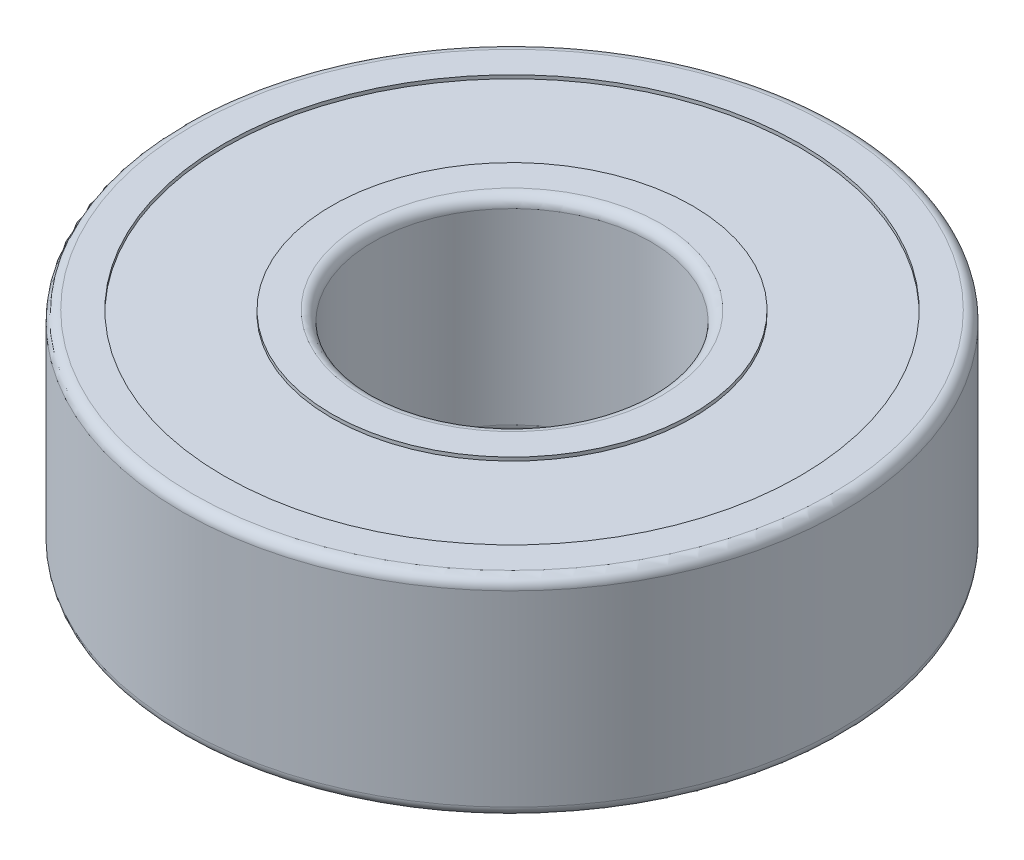
ISO-10303-21;
HEADER;
FILE_DESCRIPTION(('STEP AP214'),'2;1');
FILE_NAME('part.step','',(''),(''),'','','');
FILE_SCHEMA(('AUTOMOTIVE_DESIGN { 1 0 10303 214 1 1 1 1 }'));
ENDSEC;
DATA;
#1=APPLICATION_CONTEXT('core data for automotive mechanical design processes');
#2=APPLICATION_PROTOCOL_DEFINITION('international standard','automotive_design',2000,#1);
#3=PRODUCT_CONTEXT('',#1,'mechanical');
#4=PRODUCT('Part','Part','',(#3));
#5=PRODUCT_RELATED_PRODUCT_CATEGORY('part','',(#4));
#6=PRODUCT_DEFINITION_FORMATION('','',#4);
#7=PRODUCT_DEFINITION_CONTEXT('part definition',#1,'design');
#8=PRODUCT_DEFINITION('design','',#6,#7);
#9=PRODUCT_DEFINITION_SHAPE('','',#8);
#10=(LENGTH_UNIT() NAMED_UNIT(*) SI_UNIT(.MILLI.,.METRE.));
#11=(NAMED_UNIT(*) PLANE_ANGLE_UNIT() SI_UNIT($,.RADIAN.));
#12=(NAMED_UNIT(*) SI_UNIT($,.STERADIAN.) SOLID_ANGLE_UNIT());
#13=UNCERTAINTY_MEASURE_WITH_UNIT(LENGTH_MEASURE(1.E-05),#10,'distance_accuracy_value','');
#14=(GEOMETRIC_REPRESENTATION_CONTEXT(3) GLOBAL_UNCERTAINTY_ASSIGNED_CONTEXT((#13)) GLOBAL_UNIT_ASSIGNED_CONTEXT((#10,
#11,#12)) REPRESENTATION_CONTEXT('',''));
#15=CARTESIAN_POINT('',(0.,0.,0.));
#16=DIRECTION('',(0.,0.,1.));
#17=DIRECTION('',(1.,0.,0.));
#18=AXIS2_PLACEMENT_3D('',#15,#16,#17);
#19=CARTESIAN_POINT('',(0.,0.,0.));
#20=DIRECTION('',(0.,1.,0.));
#21=DIRECTION('',(0.,0.,1.));
#22=AXIS2_PLACEMENT_3D('',#19,#20,#21);
#23=PLANE('',#22);
#24=CARTESIAN_POINT('',(0.,0.,0.));
#25=DIRECTION('',(0.,1.,0.));
#26=DIRECTION('',(0.,0.,1.));
#27=AXIS2_PLACEMENT_3D('',#24,#25,#26);
#28=CIRCLE('',#27,4.3);
#29=CARTESIAN_POINT('',(0.,0.,4.3));
#30=VERTEX_POINT('',#29);
#31=EDGE_CURVE('E57',#30,#30,#28,.T.);
#32=ORIENTED_EDGE('',*,*,#31,.T.);
#33=EDGE_LOOP('',(#32));
#34=FACE_BOUND('',#33,.T.);
#35=CARTESIAN_POINT('',(0.,0.,0.));
#36=DIRECTION('',(0.,1.,0.));
#37=DIRECTION('',(0.,0.,1.));
#38=AXIS2_PLACEMENT_3D('',#35,#36,#37);
#39=CIRCLE('',#38,5.2);
#40=CARTESIAN_POINT('',(0.,0.,5.2));
#41=VERTEX_POINT('',#40);
#42=EDGE_CURVE('E88',#41,#41,#39,.T.);
#43=ORIENTED_EDGE('',*,*,#42,.F.);
#44=EDGE_LOOP('',(#43));
#45=FACE_BOUND('',#44,.T.);
#46=ADVANCED_FACE('F37',(#34,#45),#23,.F.);
#47=CARTESIAN_POINT('',(0.,6.,0.));
#48=DIRECTION('',(0.,1.,0.));
#49=DIRECTION('',(0.,0.,1.));
#50=AXIS2_PLACEMENT_3D('',#47,#48,#49);
#51=PLANE('',#50);
#52=CARTESIAN_POINT('',(0.,6.,0.));
#53=DIRECTION('',(0.,1.,0.));
#54=DIRECTION('',(0.,0.,1.));
#55=AXIS2_PLACEMENT_3D('',#52,#53,#54);
#56=CIRCLE('',#55,4.3);
#57=CARTESIAN_POINT('',(0.,6.,4.3));
#58=VERTEX_POINT('',#57);
#59=EDGE_CURVE('E60',#58,#58,#56,.F.);
#60=ORIENTED_EDGE('',*,*,#59,.T.);
#61=EDGE_LOOP('',(#60));
#62=FACE_BOUND('',#61,.T.);
#63=CARTESIAN_POINT('',(0.,6.,0.));
#64=DIRECTION('',(0.,1.,0.));
#65=DIRECTION('',(0.,0.,1.));
#66=AXIS2_PLACEMENT_3D('',#63,#64,#65);
#67=CIRCLE('',#66,5.2);
#68=CARTESIAN_POINT('',(0.,6.,5.2));
#69=VERTEX_POINT('',#68);
#70=EDGE_CURVE('E76',#69,#69,#67,.T.);
#71=ORIENTED_EDGE('',*,*,#70,.T.);
#72=EDGE_LOOP('',(#71));
#73=FACE_BOUND('',#72,.T.);
#74=ADVANCED_FACE('F105',(#62,#73),#51,.T.);
#75=CARTESIAN_POINT('',(0.,6.,0.));
#76=DIRECTION('',(0.,1.,0.));
#77=DIRECTION('',(0.,0.,1.));
#78=AXIS2_PLACEMENT_3D('',#75,#76,#77);
#79=CIRCLE('',#78,9.2);
#80=CARTESIAN_POINT('',(0.,6.,9.2));
#81=VERTEX_POINT('',#80);
#82=EDGE_CURVE('E10',#81,#81,#79,.T.);
#83=ORIENTED_EDGE('',*,*,#82,.T.);
#84=EDGE_LOOP('',(#83));
#85=FACE_BOUND('',#84,.T.);
#86=CARTESIAN_POINT('',(0.,6.,0.));
#87=DIRECTION('',(0.,1.,0.));
#88=DIRECTION('',(0.,0.,1.));
#89=AXIS2_PLACEMENT_3D('',#86,#87,#88);
#90=CIRCLE('',#89,8.3);
#91=CARTESIAN_POINT('',(0.,6.,8.3));
#92=VERTEX_POINT('',#91);
#93=EDGE_CURVE('E70',#92,#92,#90,.T.);
#94=ORIENTED_EDGE('',*,*,#93,.F.);
#95=EDGE_LOOP('',(#94));
#96=FACE_BOUND('',#95,.T.);
#97=ADVANCED_FACE('F112',(#85,#96),#51,.T.);
#98=CARTESIAN_POINT('',(0.,0.,0.));
#99=DIRECTION('',(0.,1.,0.));
#100=DIRECTION('',(0.,0.,1.));
#101=AXIS2_PLACEMENT_3D('',#98,#99,#100);
#102=CIRCLE('',#101,9.2);
#103=CARTESIAN_POINT('',(0.,0.,9.2));
#104=VERTEX_POINT('',#103);
#105=EDGE_CURVE('E44',#104,#104,#102,.F.);
#106=ORIENTED_EDGE('',*,*,#105,.T.);
#107=EDGE_LOOP('',(#106));
#108=FACE_BOUND('',#107,.T.);
#109=CARTESIAN_POINT('',(0.,0.,0.));
#110=DIRECTION('',(0.,1.,0.));
#111=DIRECTION('',(0.,0.,1.));
#112=AXIS2_PLACEMENT_3D('',#109,#110,#111);
#113=CIRCLE('',#112,8.3);
#114=CARTESIAN_POINT('',(0.,0.,8.3));
#115=VERTEX_POINT('',#114);
#116=EDGE_CURVE('E82',#115,#115,#113,.T.);
#117=ORIENTED_EDGE('',*,*,#116,.T.);
#118=EDGE_LOOP('',(#117));
#119=FACE_BOUND('',#118,.T.);
#120=ADVANCED_FACE('F108',(#108,#119),#23,.F.);
#121=CARTESIAN_POINT('',(0.,6.,0.));
#122=DIRECTION('',(0.,-1.,0.));
#123=DIRECTION('',(0.,0.,-1.));
#124=AXIS2_PLACEMENT_3D('',#121,#122,#123);
#125=CYLINDRICAL_SURFACE('',#124,9.5);
#126=CARTESIAN_POINT('',(0.,0.3,0.));
#127=DIRECTION('',(0.,1.,0.));
#128=DIRECTION('',(0.,0.,1.));
#129=AXIS2_PLACEMENT_3D('',#126,#127,#128);
#130=CIRCLE('',#129,9.5);
#131=CARTESIAN_POINT('',(0.,0.3,9.5));
#132=VERTEX_POINT('',#131);
#133=EDGE_CURVE('E48',#132,#132,#130,.T.);
#134=ORIENTED_EDGE('',*,*,#133,.T.);
#135=EDGE_LOOP('',(#134));
#136=FACE_BOUND('',#135,.T.);
#137=CARTESIAN_POINT('',(0.,5.7,0.));
#138=DIRECTION('',(0.,1.,0.));
#139=DIRECTION('',(0.,0.,1.));
#140=AXIS2_PLACEMENT_3D('',#137,#138,#139);
#141=CIRCLE('',#140,9.5);
#142=CARTESIAN_POINT('',(0.,5.7,9.5));
#143=VERTEX_POINT('',#142);
#144=EDGE_CURVE('E52',#143,#143,#141,.F.);
#145=ORIENTED_EDGE('',*,*,#144,.T.);
#146=EDGE_LOOP('',(#145));
#147=FACE_BOUND('',#146,.T.);
#148=ADVANCED_FACE('F117',(#136,#147),#125,.T.);
#149=CARTESIAN_POINT('',(0.,6.,0.));
#150=DIRECTION('',(0.,-1.,0.));
#151=DIRECTION('',(0.,0.,-1.));
#152=AXIS2_PLACEMENT_3D('',#149,#150,#151);
#153=CYLINDRICAL_SURFACE('',#152,4.);
#154=CARTESIAN_POINT('',(0.,5.7,0.));
#155=DIRECTION('',(0.,1.,0.));
#156=DIRECTION('',(0.,0.,1.));
#157=AXIS2_PLACEMENT_3D('',#154,#155,#156);
#158=CIRCLE('',#157,4.);
#159=CARTESIAN_POINT('',(0.,5.7,4.));
#160=VERTEX_POINT('',#159);
#161=EDGE_CURVE('E63',#160,#160,#158,.T.);
#162=ORIENTED_EDGE('',*,*,#161,.T.);
#163=EDGE_LOOP('',(#162));
#164=FACE_BOUND('',#163,.T.);
#165=CARTESIAN_POINT('',(0.,0.3,0.));
#166=DIRECTION('',(0.,1.,0.));
#167=DIRECTION('',(0.,0.,1.));
#168=AXIS2_PLACEMENT_3D('',#165,#166,#167);
#169=CIRCLE('',#168,4.);
#170=CARTESIAN_POINT('',(0.,0.3,4.));
#171=VERTEX_POINT('',#170);
#172=EDGE_CURVE('E66',#171,#171,#169,.F.);
#173=ORIENTED_EDGE('',*,*,#172,.T.);
#174=EDGE_LOOP('',(#173));
#175=FACE_BOUND('',#174,.T.);
#176=ADVANCED_FACE('F122',(#164,#175),#153,.F.);
#177=CARTESIAN_POINT('',(0.,5.9,0.));
#178=DIRECTION('',(0.,1.,0.));
#179=DIRECTION('',(0.,0.,1.));
#180=AXIS2_PLACEMENT_3D('',#177,#178,#179);
#181=CYLINDRICAL_SURFACE('',#180,8.3);
#182=CARTESIAN_POINT('',(0.,5.9,0.));
#183=DIRECTION('',(0.,1.,0.));
#184=DIRECTION('',(0.,0.,1.));
#185=AXIS2_PLACEMENT_3D('',#182,#183,#184);
#186=CIRCLE('',#185,8.3);
#187=CARTESIAN_POINT('',(0.,5.9,8.3));
#188=VERTEX_POINT('',#187);
#189=EDGE_CURVE('E69',#188,#188,#186,.T.);
#190=ORIENTED_EDGE('',*,*,#189,.F.);
#191=EDGE_LOOP('',(#190));
#192=FACE_BOUND('',#191,.T.);
#193=ORIENTED_EDGE('',*,*,#93,.T.);
#194=EDGE_LOOP('',(#193));
#195=FACE_BOUND('',#194,.T.);
#196=ADVANCED_FACE('F143',(#192,#195),#181,.F.);
#197=CARTESIAN_POINT('',(0.,5.9,0.));
#198=DIRECTION('',(0.,1.,0.));
#199=DIRECTION('',(0.,0.,1.));
#200=AXIS2_PLACEMENT_3D('',#197,#198,#199);
#201=PLANE('',#200);
#202=CARTESIAN_POINT('',(0.,5.9,0.));
#203=DIRECTION('',(0.,1.,0.));
#204=DIRECTION('',(0.,0.,1.));
#205=AXIS2_PLACEMENT_3D('',#202,#203,#204);
#206=CIRCLE('',#205,5.2);
#207=CARTESIAN_POINT('',(0.,5.9,5.2));
#208=VERTEX_POINT('',#207);
#209=EDGE_CURVE('E73',#208,#208,#206,.T.);
#210=ORIENTED_EDGE('',*,*,#209,.F.);
#211=EDGE_LOOP('',(#210));
#212=FACE_BOUND('',#211,.T.);
#213=ORIENTED_EDGE('',*,*,#189,.T.);
#214=EDGE_LOOP('',(#213));
#215=FACE_BOUND('',#214,.T.);
#216=ADVANCED_FACE('F139',(#212,#215),#201,.T.);
#217=CARTESIAN_POINT('',(0.,5.9,0.));
#218=DIRECTION('',(0.,1.,0.));
#219=DIRECTION('',(0.,0.,1.));
#220=AXIS2_PLACEMENT_3D('',#217,#218,#219);
#221=CYLINDRICAL_SURFACE('',#220,5.2);
#222=ORIENTED_EDGE('',*,*,#209,.T.);
#223=EDGE_LOOP('',(#222));
#224=FACE_BOUND('',#223,.T.);
#225=ORIENTED_EDGE('',*,*,#70,.F.);
#226=EDGE_LOOP('',(#225));
#227=FACE_BOUND('',#226,.T.);
#228=ADVANCED_FACE('F133',(#224,#227),#221,.T.);
#229=CARTESIAN_POINT('',(0.,0.1,0.));
#230=DIRECTION('',(0.,-1.,0.));
#231=DIRECTION('',(0.,0.,1.));
#232=AXIS2_PLACEMENT_3D('',#229,#230,#231);
#233=PLANE('',#232);
#234=CARTESIAN_POINT('',(0.,0.1,0.));
#235=DIRECTION('',(0.,1.,0.));
#236=DIRECTION('',(0.,0.,1.));
#237=AXIS2_PLACEMENT_3D('',#234,#235,#236);
#238=CIRCLE('',#237,8.3);
#239=CARTESIAN_POINT('',(0.,0.1,8.3));
#240=VERTEX_POINT('',#239);
#241=EDGE_CURVE('E79',#240,#240,#238,.T.);
#242=ORIENTED_EDGE('',*,*,#241,.F.);
#243=EDGE_LOOP('',(#242));
#244=FACE_BOUND('',#243,.T.);
#245=CARTESIAN_POINT('',(0.,0.1,0.));
#246=DIRECTION('',(0.,1.,0.));
#247=DIRECTION('',(0.,0.,1.));
#248=AXIS2_PLACEMENT_3D('',#245,#246,#247);
#249=CIRCLE('',#248,5.2);
#250=CARTESIAN_POINT('',(0.,0.1,5.2));
#251=VERTEX_POINT('',#250);
#252=EDGE_CURVE('E85',#251,#251,#249,.T.);
#253=ORIENTED_EDGE('',*,*,#252,.T.);
#254=EDGE_LOOP('',(#253));
#255=FACE_BOUND('',#254,.T.);
#256=ADVANCED_FACE('F94',(#244,#255),#233,.T.);
#257=CARTESIAN_POINT('',(0.,0.1,0.));
#258=DIRECTION('',(0.,-1.,0.));
#259=DIRECTION('',(0.,0.,-1.));
#260=AXIS2_PLACEMENT_3D('',#257,#258,#259);
#261=CYLINDRICAL_SURFACE('',#260,8.3);
#262=ORIENTED_EDGE('',*,*,#241,.T.);
#263=EDGE_LOOP('',(#262));
#264=FACE_BOUND('',#263,.T.);
#265=ORIENTED_EDGE('',*,*,#116,.F.);
#266=EDGE_LOOP('',(#265));
#267=FACE_BOUND('',#266,.T.);
#268=ADVANCED_FACE('F100',(#264,#267),#261,.F.);
#269=CARTESIAN_POINT('',(0.,0.1,0.));
#270=DIRECTION('',(0.,-1.,0.));
#271=DIRECTION('',(0.,0.,-1.));
#272=AXIS2_PLACEMENT_3D('',#269,#270,#271);
#273=CYLINDRICAL_SURFACE('',#272,5.2);
#274=ORIENTED_EDGE('',*,*,#252,.F.);
#275=EDGE_LOOP('',(#274));
#276=FACE_BOUND('',#275,.T.);
#277=ORIENTED_EDGE('',*,*,#42,.T.);
#278=EDGE_LOOP('',(#277));
#279=FACE_BOUND('',#278,.T.);
#280=ADVANCED_FACE('F96',(#276,#279),#273,.T.);
#281=CARTESIAN_POINT('',(0.,5.7,0.));
#282=DIRECTION('',(0.,1.,0.));
#283=DIRECTION('',(0.,0.,1.));
#284=AXIS2_PLACEMENT_3D('',#281,#282,#283);
#285=TOROIDAL_SURFACE('',#284,4.3,0.3);
#286=ORIENTED_EDGE('',*,*,#59,.F.);
#287=EDGE_LOOP('',(#286));
#288=FACE_BOUND('',#287,.T.);
#289=ORIENTED_EDGE('',*,*,#161,.F.);
#290=EDGE_LOOP('',(#289));
#291=FACE_BOUND('',#290,.T.);
#292=ADVANCED_FACE('F99',(#288,#291),#285,.T.);
#293=CARTESIAN_POINT('',(0.,0.3,0.));
#294=DIRECTION('',(0.,1.,0.));
#295=DIRECTION('',(0.,0.,1.));
#296=AXIS2_PLACEMENT_3D('',#293,#294,#295);
#297=TOROIDAL_SURFACE('',#296,4.3,0.3);
#298=ORIENTED_EDGE('',*,*,#172,.F.);
#299=EDGE_LOOP('',(#298));
#300=FACE_BOUND('',#299,.T.);
#301=ORIENTED_EDGE('',*,*,#31,.F.);
#302=EDGE_LOOP('',(#301));
#303=FACE_BOUND('',#302,.T.);
#304=ADVANCED_FACE('F156',(#300,#303),#297,.T.);
#305=CARTESIAN_POINT('',(0.,0.3,0.));
#306=DIRECTION('',(0.,1.,0.));
#307=DIRECTION('',(0.,0.,1.));
#308=AXIS2_PLACEMENT_3D('',#305,#306,#307);
#309=TOROIDAL_SURFACE('',#308,9.2,0.3);
#310=ORIENTED_EDGE('',*,*,#105,.F.);
#311=EDGE_LOOP('',(#310));
#312=FACE_BOUND('',#311,.T.);
#313=ORIENTED_EDGE('',*,*,#133,.F.);
#314=EDGE_LOOP('',(#313));
#315=FACE_BOUND('',#314,.T.);
#316=ADVANCED_FACE('F159',(#312,#315),#309,.T.);
#317=CARTESIAN_POINT('',(0.,5.7,0.));
#318=DIRECTION('',(0.,1.,0.));
#319=DIRECTION('',(0.,0.,1.));
#320=AXIS2_PLACEMENT_3D('',#317,#318,#319);
#321=TOROIDAL_SURFACE('',#320,9.2,0.3);
#322=ORIENTED_EDGE('',*,*,#144,.F.);
#323=EDGE_LOOP('',(#322));
#324=FACE_BOUND('',#323,.T.);
#325=ORIENTED_EDGE('',*,*,#82,.F.);
#326=EDGE_LOOP('',(#325));
#327=FACE_BOUND('',#326,.T.);
#328=ADVANCED_FACE('F39',(#324,#327),#321,.T.);
#329=CLOSED_SHELL('',(#46,#74,#97,#120,#148,#176,#196,#216,#228,#256,#268,#280,#292,#304,#316,#328));
#330=MANIFOLD_SOLID_BREP('B2',#329);
#331=ADVANCED_BREP_SHAPE_REPRESENTATION('',(#18,#330),#14);
#332=SHAPE_DEFINITION_REPRESENTATION(#9,#331);
ENDSEC;
END-ISO-10303-21;
